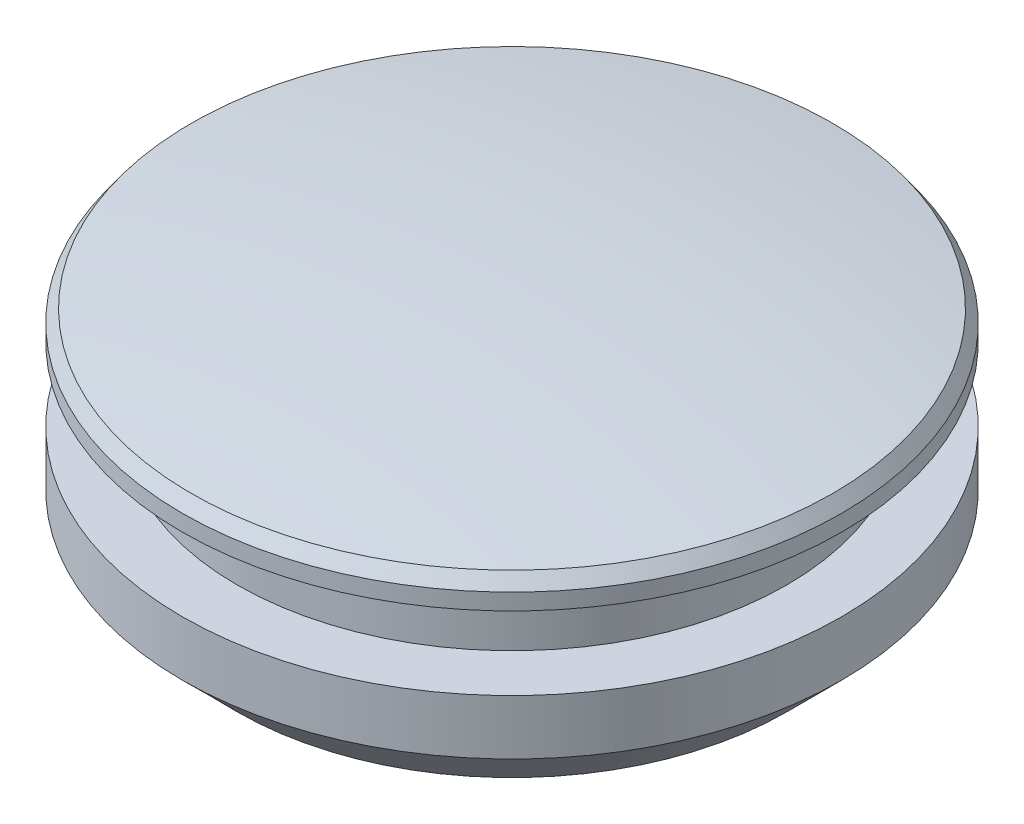
ISO-10303-21;
HEADER;
FILE_DESCRIPTION(('STEP AP214'),'2;1');
FILE_NAME('part.step','',(''),(''),'','','');
FILE_SCHEMA(('AUTOMOTIVE_DESIGN { 1 0 10303 214 1 1 1 1 }'));
ENDSEC;
DATA;
#1=APPLICATION_CONTEXT('core data for automotive mechanical design processes');
#2=APPLICATION_PROTOCOL_DEFINITION('international standard','automotive_design',2000,#1);
#3=PRODUCT_CONTEXT('',#1,'mechanical');
#4=PRODUCT('Part','Part','',(#3));
#5=PRODUCT_RELATED_PRODUCT_CATEGORY('part','',(#4));
#6=PRODUCT_DEFINITION_FORMATION('','',#4);
#7=PRODUCT_DEFINITION_CONTEXT('part definition',#1,'design');
#8=PRODUCT_DEFINITION('design','',#6,#7);
#9=PRODUCT_DEFINITION_SHAPE('','',#8);
#10=(LENGTH_UNIT() NAMED_UNIT(*) SI_UNIT(.MILLI.,.METRE.));
#11=(NAMED_UNIT(*) PLANE_ANGLE_UNIT() SI_UNIT($,.RADIAN.));
#12=(NAMED_UNIT(*) SI_UNIT($,.STERADIAN.) SOLID_ANGLE_UNIT());
#13=UNCERTAINTY_MEASURE_WITH_UNIT(LENGTH_MEASURE(1.E-05),#10,'distance_accuracy_value','');
#14=(GEOMETRIC_REPRESENTATION_CONTEXT(3) GLOBAL_UNCERTAINTY_ASSIGNED_CONTEXT((#13)) GLOBAL_UNIT_ASSIGNED_CONTEXT((#10,
#11,#12)) REPRESENTATION_CONTEXT('',''));
#15=CARTESIAN_POINT('',(0.,0.,0.));
#16=DIRECTION('',(0.,0.,1.));
#17=DIRECTION('',(1.,0.,0.));
#18=AXIS2_PLACEMENT_3D('',#15,#16,#17);
#19=CARTESIAN_POINT('',(0.,1.50000000000006,0.));
#20=DIRECTION('',(0.,1.,0.));
#21=DIRECTION('',(-1.,0.,0.));
#22=AXIS2_PLACEMENT_3D('',#19,#20,#21);
#23=CONICAL_SURFACE('',#22,8.99999999999999,0.785398163397428);
#24=CARTESIAN_POINT('',(0.,0.,0.));
#25=DIRECTION('',(0.,-1.,0.));
#26=DIRECTION('',(1.,0.,0.));
#27=AXIS2_PLACEMENT_3D('',#24,#25,#26);
#28=CIRCLE('',#27,7.5);
#29=CARTESIAN_POINT('',(7.5,0.,0.));
#30=VERTEX_POINT('',#29);
#31=EDGE_CURVE('E56',#30,#30,#28,.T.);
#32=ORIENTED_EDGE('',*,*,#31,.F.);
#33=EDGE_LOOP('',(#32));
#34=FACE_BOUND('',#33,.T.);
#35=CARTESIAN_POINT('',(0.,1.50000000000006,0.));
#36=DIRECTION('',(0.,-1.,0.));
#37=DIRECTION('',(1.,0.,0.));
#38=AXIS2_PLACEMENT_3D('',#35,#36,#37);
#39=CIRCLE('',#38,8.99999999999999);
#40=CARTESIAN_POINT('',(8.99999999999999,1.50000000000009,0.));
#41=VERTEX_POINT('',#40);
#42=EDGE_CURVE('E110',#41,#41,#39,.T.);
#43=ORIENTED_EDGE('',*,*,#42,.T.);
#44=EDGE_LOOP('',(#43));
#45=FACE_BOUND('',#44,.T.);
#46=ADVANCED_FACE('F35',(#34,#45),#23,.T.);
#47=CARTESIAN_POINT('',(-6.,0.,0.));
#48=DIRECTION('',(0.,1.,0.));
#49=DIRECTION('',(-1.,0.,0.));
#50=AXIS2_PLACEMENT_3D('',#47,#48,#49);
#51=PLANE('',#50);
#52=CARTESIAN_POINT('',(0.,0.,0.));
#53=DIRECTION('',(0.,1.,0.));
#54=DIRECTION('',(-1.,0.,0.));
#55=AXIS2_PLACEMENT_3D('',#52,#53,#54);
#56=CIRCLE('',#55,6.24999999999996);
#57=CARTESIAN_POINT('',(-6.24999999999996,0.,0.));
#58=VERTEX_POINT('',#57);
#59=EDGE_CURVE('E69',#58,#58,#56,.T.);
#60=ORIENTED_EDGE('',*,*,#59,.T.);
#61=EDGE_LOOP('',(#60));
#62=FACE_BOUND('',#61,.T.);
#63=ORIENTED_EDGE('',*,*,#31,.T.);
#64=EDGE_LOOP('',(#63));
#65=FACE_BOUND('',#64,.T.);
#66=ADVANCED_FACE('F87',(#62,#65),#51,.F.);
#67=CARTESIAN_POINT('',(3.43024899888577E-12,-1000.,0.));
#68=DIRECTION('',(0.,-1.,0.));
#69=DIRECTION('',(1.,0.,0.));
#70=AXIS2_PLACEMENT_3D('',#67,#68,#69);
#71=CYLINDRICAL_SURFACE('',#70,5.99999999999999);
#72=CARTESIAN_POINT('',(0.,0.250000000000083,0.));
#73=DIRECTION('',(0.,1.,0.));
#74=DIRECTION('',(-1.,0.,0.));
#75=AXIS2_PLACEMENT_3D('',#72,#73,#74);
#76=CIRCLE('',#75,5.99999999999999);
#77=CARTESIAN_POINT('',(-6.,0.250000000000063,0.));
#78=VERTEX_POINT('',#77);
#79=EDGE_CURVE('E60',#78,#78,#76,.F.);
#80=ORIENTED_EDGE('',*,*,#79,.T.);
#81=EDGE_LOOP('',(#80));
#82=FACE_BOUND('',#81,.T.);
#83=CARTESIAN_POINT('',(0.,2.99999999999989,0.));
#84=DIRECTION('',(0.,-1.,0.));
#85=DIRECTION('',(1.,0.,0.));
#86=AXIS2_PLACEMENT_3D('',#83,#84,#85);
#87=CIRCLE('',#86,5.99999999999999);
#88=CARTESIAN_POINT('',(5.99999999999998,2.99999999999991,0.));
#89=VERTEX_POINT('',#88);
#90=EDGE_CURVE('E54',#89,#89,#87,.T.);
#91=ORIENTED_EDGE('',*,*,#90,.F.);
#92=EDGE_LOOP('',(#91));
#93=FACE_BOUND('',#92,.T.);
#94=ADVANCED_FACE('F50',(#82,#93),#71,.F.);
#95=CARTESIAN_POINT('',(0.,2.99999999999998,0.));
#96=DIRECTION('',(0.,0.,-1.));
#97=DIRECTION('',(-1.,0.,0.));
#98=AXIS2_PLACEMENT_3D('',#95,#96,#97);
#99=ELLIPSE('',#98,6.,2.);
#100=TRIMMED_CURVE('',#99,(PARAMETER_VALUE(-1.5707963267949)),
(PARAMETER_VALUE(1.57079632679489)),.T.,.PARAMETER.);
#101=CARTESIAN_POINT('',(3.43024899888577E-12,-1000.,0.));
#102=DIRECTION('',(0.,-1.,0.));
#103=AXIS1_PLACEMENT('',#101,#102);
#104=SURFACE_OF_REVOLUTION('',#100,#103);
#105=CARTESIAN_POINT('',(0.,4.99999999999998,0.));
#106=VERTEX_POINT('',#105);
#107=VERTEX_LOOP('',#106);
#108=FACE_BOUND('',#107,.T.);
#109=ORIENTED_EDGE('',*,*,#90,.T.);
#110=EDGE_LOOP('',(#109));
#111=FACE_BOUND('',#110,.T.);
#112=ADVANCED_FACE('F46',(#108,#111),#104,.T.);
#113=CARTESIAN_POINT('',(0.,-47.875,0.));
#114=DIRECTION('',(0.,-1.,0.));
#115=DIRECTION('',(1.,0.,0.));
#116=AXIS2_PLACEMENT_3D('',#113,#114,#115);
#117=SPHERICAL_SURFACE('',#116,54.375);
#118=CARTESIAN_POINT('',(-1.84086783753278E-13,5.79072042235849,0.));
#119=DIRECTION('',(0.,-1.,0.));
#120=DIRECTION('',(1.,0.,0.));
#121=AXIS2_PLACEMENT_3D('',#118,#119,#120);
#122=CIRCLE('',#121,8.75391778287018);
#123=CARTESIAN_POINT('',(8.75391778287015,5.79072042235852,0.));
#124=VERTEX_POINT('',#123);
#125=EDGE_CURVE('E11',#124,#124,#122,.F.);
#126=ORIENTED_EDGE('',*,*,#125,.T.);
#127=EDGE_LOOP('',(#126));
#128=FACE_BOUND('',#127,.T.);
#129=ADVANCED_FACE('F49',(#128),#117,.T.);
#130=CARTESIAN_POINT('',(3.43024899888577E-12,-1000.,0.));
#131=DIRECTION('',(0.,-1.,0.));
#132=DIRECTION('',(1.,0.,0.));
#133=AXIS2_PLACEMENT_3D('',#130,#131,#132);
#134=CYLINDRICAL_SURFACE('',#133,8.99999999999998);
#135=CARTESIAN_POINT('',(0.,5.44537815126045,0.));
#136=DIRECTION('',(0.,-1.,0.));
#137=DIRECTION('',(1.,0.,0.));
#138=AXIS2_PLACEMENT_3D('',#135,#136,#137);
#139=CIRCLE('',#138,8.99999999999998);
#140=CARTESIAN_POINT('',(8.99999999999989,5.44537815126048,0.));
#141=VERTEX_POINT('',#140);
#142=EDGE_CURVE('E43',#141,#141,#139,.T.);
#143=ORIENTED_EDGE('',*,*,#142,.T.);
#144=EDGE_LOOP('',(#143));
#145=FACE_BOUND('',#144,.T.);
#146=CARTESIAN_POINT('',(0.,4.99999999999989,0.));
#147=DIRECTION('',(0.,-1.,0.));
#148=DIRECTION('',(1.,0.,0.));
#149=AXIS2_PLACEMENT_3D('',#146,#147,#148);
#150=CIRCLE('',#149,8.99999999999998);
#151=CARTESIAN_POINT('',(8.99999999999996,4.99999999999992,0.));
#152=VERTEX_POINT('',#151);
#153=EDGE_CURVE('E57',#152,#152,#150,.T.);
#154=ORIENTED_EDGE('',*,*,#153,.F.);
#155=EDGE_LOOP('',(#154));
#156=FACE_BOUND('',#155,.T.);
#157=ADVANCED_FACE('F74',(#145,#156),#134,.T.);
#158=CARTESIAN_POINT('',(-7.5,4.99999999999998,0.));
#159=DIRECTION('',(0.,1.,0.));
#160=DIRECTION('',(-1.,0.,0.));
#161=AXIS2_PLACEMENT_3D('',#158,#159,#160);
#162=PLANE('',#161);
#163=CARTESIAN_POINT('',(0.,4.99999999999989,0.));
#164=DIRECTION('',(0.,-1.,0.));
#165=DIRECTION('',(1.,0.,0.));
#166=AXIS2_PLACEMENT_3D('',#163,#164,#165);
#167=CIRCLE('',#166,7.49999999999998);
#168=CARTESIAN_POINT('',(7.49999999999997,4.99999999999992,0.));
#169=VERTEX_POINT('',#168);
#170=EDGE_CURVE('E63',#169,#169,#167,.T.);
#171=ORIENTED_EDGE('',*,*,#170,.F.);
#172=EDGE_LOOP('',(#171));
#173=FACE_BOUND('',#172,.T.);
#174=ORIENTED_EDGE('',*,*,#153,.T.);
#175=EDGE_LOOP('',(#174));
#176=FACE_BOUND('',#175,.T.);
#177=ADVANCED_FACE('F123',(#173,#176),#162,.F.);
#178=CARTESIAN_POINT('',(3.43024899888577E-12,-1000.,0.));
#179=DIRECTION('',(0.,-1.,0.));
#180=DIRECTION('',(1.,0.,0.));
#181=AXIS2_PLACEMENT_3D('',#178,#179,#180);
#182=CYLINDRICAL_SURFACE('',#181,7.49999999999999);
#183=CARTESIAN_POINT('',(0.,2.99999999999989,0.));
#184=DIRECTION('',(0.,-1.,0.));
#185=DIRECTION('',(1.,0.,0.));
#186=AXIS2_PLACEMENT_3D('',#183,#184,#185);
#187=CIRCLE('',#186,7.49999999999999);
#188=CARTESIAN_POINT('',(7.49999999999998,2.99999999999992,0.));
#189=VERTEX_POINT('',#188);
#190=EDGE_CURVE('E116',#189,#189,#187,.T.);
#191=ORIENTED_EDGE('',*,*,#190,.F.);
#192=EDGE_LOOP('',(#191));
#193=FACE_BOUND('',#192,.T.);
#194=ORIENTED_EDGE('',*,*,#170,.T.);
#195=EDGE_LOOP('',(#194));
#196=FACE_BOUND('',#195,.T.);
#197=ADVANCED_FACE('F121',(#193,#196),#182,.T.);
#198=CARTESIAN_POINT('',(-9.,2.99999999999998,0.));
#199=DIRECTION('',(0.,-1.,0.));
#200=DIRECTION('',(1.,0.,0.));
#201=AXIS2_PLACEMENT_3D('',#198,#199,#200);
#202=PLANE('',#201);
#203=CARTESIAN_POINT('',(0.,2.99999999999989,0.));
#204=DIRECTION('',(0.,-1.,0.));
#205=DIRECTION('',(1.,0.,0.));
#206=AXIS2_PLACEMENT_3D('',#203,#204,#205);
#207=CIRCLE('',#206,8.99999999999999);
#208=CARTESIAN_POINT('',(8.99999999999998,2.99999999999992,0.));
#209=VERTEX_POINT('',#208);
#210=EDGE_CURVE('E113',#209,#209,#207,.T.);
#211=ORIENTED_EDGE('',*,*,#210,.F.);
#212=EDGE_LOOP('',(#211));
#213=FACE_BOUND('',#212,.T.);
#214=ORIENTED_EDGE('',*,*,#190,.T.);
#215=EDGE_LOOP('',(#214));
#216=FACE_BOUND('',#215,.T.);
#217=ADVANCED_FACE('F136',(#213,#216),#202,.F.);
#218=CARTESIAN_POINT('',(3.43024899888577E-12,-1000.,0.));
#219=DIRECTION('',(0.,-1.,0.));
#220=DIRECTION('',(1.,0.,0.));
#221=AXIS2_PLACEMENT_3D('',#218,#219,#220);
#222=CYLINDRICAL_SURFACE('',#221,8.99999999999999);
#223=ORIENTED_EDGE('',*,*,#42,.F.);
#224=EDGE_LOOP('',(#223));
#225=FACE_BOUND('',#224,.T.);
#226=ORIENTED_EDGE('',*,*,#210,.T.);
#227=EDGE_LOOP('',(#226));
#228=FACE_BOUND('',#227,.T.);
#229=ADVANCED_FACE('F83',(#225,#228),#222,.T.);
#230=CARTESIAN_POINT('',(0.,0.250000000000083,0.));
#231=DIRECTION('',(0.,-1.,0.));
#232=DIRECTION('',(1.,0.,0.));
#233=AXIS2_PLACEMENT_3D('',#230,#231,#232);
#234=CONICAL_SURFACE('',#233,5.99999999999999,0.785398163397261);
#235=ORIENTED_EDGE('',*,*,#59,.F.);
#236=EDGE_LOOP('',(#235));
#237=FACE_BOUND('',#236,.T.);
#238=ORIENTED_EDGE('',*,*,#79,.F.);
#239=EDGE_LOOP('',(#238));
#240=FACE_BOUND('',#239,.T.);
#241=ADVANCED_FACE('F78',(#237,#240),#234,.F.);
#242=CARTESIAN_POINT('',(0.,5.44537815126035,0.));
#243=DIRECTION('',(0.,-1.,0.));
#244=DIRECTION('',(1.,0.,0.));
#245=AXIS2_PLACEMENT_3D('',#242,#243,#244);
#246=CONICAL_SURFACE('',#245,8.99999999999998,0.619115699620566);
#247=CARTESIAN_POINT('',(8.75391778287015,5.79072042235852,0.));
#248=CARTESIAN_POINT('',(8.75648113929858,5.78712310703458,0.));
#249=CARTESIAN_POINT('',(8.75904449572702,5.78352579171064,0.));
#250=CARTESIAN_POINT('',(8.76417120858389,5.77633116106277,0.));
#251=CARTESIAN_POINT('',(8.76673456501232,5.77273384573883,0.));
#252=CARTESIAN_POINT('',(8.77186127786919,5.76553921509095,0.));
#253=CARTESIAN_POINT('',(8.77442463429763,5.76194189976701,0.));
#254=CARTESIAN_POINT('',(8.7795513471545,5.75474726911914,0.));
#255=CARTESIAN_POINT('',(8.78211470358293,5.7511499537952,0.));
#256=CARTESIAN_POINT('',(8.7872414164398,5.74395532314733,0.));
#257=CARTESIAN_POINT('',(8.78980477286824,5.74035800782339,0.));
#258=CARTESIAN_POINT('',(8.79493148572511,5.73316337717551,0.));
#259=CARTESIAN_POINT('',(8.79749484215354,5.72956606185157,0.));
#260=CARTESIAN_POINT('',(8.80262155501041,5.7223714312037,0.));
#261=CARTESIAN_POINT('',(8.80518491143885,5.71877411587976,0.));
#262=CARTESIAN_POINT('',(8.81031162429572,5.71157948523188,0.));
#263=CARTESIAN_POINT('',(8.81287498072415,5.70798216990795,0.));
#264=CARTESIAN_POINT('',(8.81800169358102,5.70078753926007,0.));
#265=CARTESIAN_POINT('',(8.82056505000946,5.69719022393613,0.));
#266=CARTESIAN_POINT('',(8.82569176286633,5.68999559328826,0.));
#267=CARTESIAN_POINT('',(8.82825511929476,5.68639827796432,0.));
#268=CARTESIAN_POINT('',(8.83338183215163,5.67920364731644,0.));
#269=CARTESIAN_POINT('',(8.83594518858007,5.67560633199251,0.));
#270=CARTESIAN_POINT('',(8.84107190143694,5.66841170134463,0.));
#271=CARTESIAN_POINT('',(8.84363525786537,5.66481438602069,0.));
#272=CARTESIAN_POINT('',(8.84876197072224,5.65761975537282,0.));
#273=CARTESIAN_POINT('',(8.85132532715068,5.65402244004888,0.));
#274=CARTESIAN_POINT('',(8.85645204000754,5.646827809401,0.));
#275=CARTESIAN_POINT('',(8.85901539643598,5.64323049407706,0.));
#276=CARTESIAN_POINT('',(8.86414210929285,5.63603586342919,0.));
#277=CARTESIAN_POINT('',(8.86670546572128,5.63243854810525,0.));
#278=CARTESIAN_POINT('',(8.87183217857815,5.62524391745737,0.));
#279=CARTESIAN_POINT('',(8.87439553500659,5.62164660213344,0.));
#280=CARTESIAN_POINT('',(8.87952224786346,5.61445197148556,0.));
#281=CARTESIAN_POINT('',(8.88208560429189,5.61085465616162,0.));
#282=CARTESIAN_POINT('',(8.88721231714876,5.60366002551375,0.));
#283=CARTESIAN_POINT('',(8.8897756735772,5.60006271018981,0.));
#284=CARTESIAN_POINT('',(8.89490238643407,5.59286807954193,0.));
#285=CARTESIAN_POINT('',(8.8974657428625,5.589270764218,0.));
#286=CARTESIAN_POINT('',(8.90259245571937,5.58207613357012,0.));
#287=CARTESIAN_POINT('',(8.90515581214781,5.57847881824618,0.));
#288=CARTESIAN_POINT('',(8.91028252500467,5.57128418759831,0.));
#289=CARTESIAN_POINT('',(8.91284588143311,5.56768687227437,0.));
#290=CARTESIAN_POINT('',(8.91797259428998,5.56049224162649,0.));
#291=CARTESIAN_POINT('',(8.92053595071841,5.55689492630255,0.));
#292=CARTESIAN_POINT('',(8.92566266357528,5.54970029565468,0.));
#293=CARTESIAN_POINT('',(8.92822602000372,5.54610298033074,0.));
#294=CARTESIAN_POINT('',(8.93335273286059,5.53890834968287,0.));
#295=CARTESIAN_POINT('',(8.93591608928902,5.53531103435893,0.));
#296=CARTESIAN_POINT('',(8.94104280214589,5.52811640371105,0.));
#297=CARTESIAN_POINT('',(8.94360615857433,5.52451908838711,0.));
#298=CARTESIAN_POINT('',(8.9487328714312,5.51732445773924,0.));
#299=CARTESIAN_POINT('',(8.95129622785963,5.5137271424153,0.));
#300=CARTESIAN_POINT('',(8.9564229407165,5.50653251176742,0.));
#301=CARTESIAN_POINT('',(8.95898629714494,5.50293519644349,0.));
#302=CARTESIAN_POINT('',(8.9641130100018,5.49574056579561,0.));
#303=CARTESIAN_POINT('',(8.96667636643024,5.49214325047167,0.));
#304=CARTESIAN_POINT('',(8.97180307928711,5.4849486198238,0.));
#305=CARTESIAN_POINT('',(8.97436643571555,5.48135130449986,0.));
#306=CARTESIAN_POINT('',(8.97949314857241,5.47415667385198,0.));
#307=CARTESIAN_POINT('',(8.98205650500085,5.47055935852805,0.));
#308=CARTESIAN_POINT('',(8.98718321785772,5.46336472788017,0.));
#309=CARTESIAN_POINT('',(8.98974657428615,5.45976741255623,0.));
#310=CARTESIAN_POINT('',(8.99487328714302,5.45257278190836,0.));
#311=CARTESIAN_POINT('',(8.99743664357146,5.44897546658442,0.));
#312=CARTESIAN_POINT('',(8.99999999999989,5.44537815126048,0.));
#313=B_SPLINE_CURVE_WITH_KNOTS('',3,(#247,#248,#249,#250,#251,#252,#253,#254,#255,#256,#257,
#258,#259,#260,#261,#262,#263,#264,#265,#266,#267,#268,#269,#270,#271,#272,#273,#274,#275,#276,
#277,#278,#279,#280,#281,#282,#283,#284,#285,#286,#287,#288,#289,#290,#291,#292,#293,#294,#295,
#296,#297,#298,#299,#300,#301,#302,#303,#304,#305,#306,#307,#308,#309,#310,#311,#312),
.UNSPECIFIED.,.F.,.F.,(4,2,2,2,2,2,2,2,2,2,2,2,2,2,2,2,2,2,2,2,2,2,2,2,2,2,2,2,2,2,2,2,4),(0.,
0.0132515381549215,0.0265030763098424,0.0397546144647632,0.053006152619684,0.0662576907746056,
0.0795092289295264,0.0927607670844473,0.106012305239368,0.119263843394291,0.132515381549211,
0.145766919704132,0.159018457859053,0.172269996013975,0.185521534168896,0.198773072323816,
0.212024610478737,0.225276148633659,0.23852768678858,0.2517792249435,0.265030763098421,
0.278282301253343,0.291533839408264,0.304785377563185,0.318036915718106,0.331288453873027,
0.344539992027948,0.357791530182869,0.37104306833779,0.38429460649271,0.397546144647631,
0.410797682802552,0.424049220957473),.UNSPECIFIED.);
#314=EDGE_CURVE('BSEAM38',#124,#141,#313,.T.);
#315=ORIENTED_EDGE('',*,*,#125,.F.);
#316=ORIENTED_EDGE('',*,*,#142,.F.);
#317=ORIENTED_EDGE('',*,*,#314,.T.);
#318=ORIENTED_EDGE('',*,*,#314,.F.);
#319=EDGE_LOOP('',(#315,#317,#316,#318));
#320=FACE_BOUND('',#319,.T.);
#321=ADVANCED_FACE('F38',(#320),#246,.T.);
#322=CLOSED_SHELL('',(#46,#66,#94,#112,#129,#157,#177,#197,#217,#229,#241,#321));
#323=MANIFOLD_SOLID_BREP('B2',#322);
#324=ADVANCED_BREP_SHAPE_REPRESENTATION('',(#18,#323),#14);
#325=SHAPE_DEFINITION_REPRESENTATION(#9,#324);
ENDSEC;
END-ISO-10303-21;
